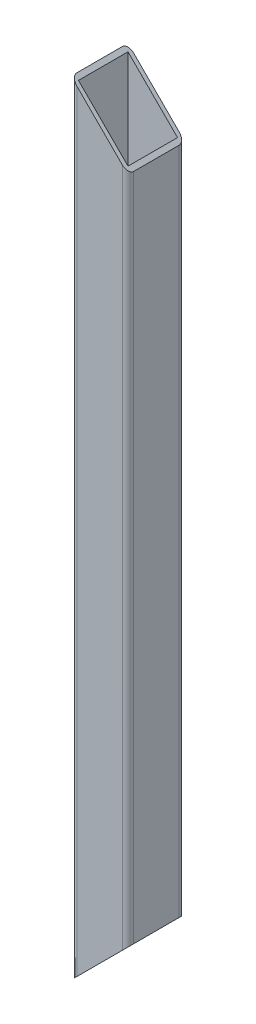
ISO-10303-21;
HEADER;
FILE_DESCRIPTION(('STEP AP214'),'2;1');
FILE_NAME('part.step','',(''),(''),'','','');
FILE_SCHEMA(('AUTOMOTIVE_DESIGN { 1 0 10303 214 1 1 1 1 }'));
ENDSEC;
DATA;
#1=APPLICATION_CONTEXT('core data for automotive mechanical design processes');
#2=APPLICATION_PROTOCOL_DEFINITION('international standard','automotive_design',2000,#1);
#3=PRODUCT_CONTEXT('',#1,'mechanical');
#4=PRODUCT('Part','Part','',(#3));
#5=PRODUCT_RELATED_PRODUCT_CATEGORY('part','',(#4));
#6=PRODUCT_DEFINITION_FORMATION('','',#4);
#7=PRODUCT_DEFINITION_CONTEXT('part definition',#1,'design');
#8=PRODUCT_DEFINITION('design','',#6,#7);
#9=PRODUCT_DEFINITION_SHAPE('','',#8);
#10=(LENGTH_UNIT() NAMED_UNIT(*) SI_UNIT(.MILLI.,.METRE.));
#11=(NAMED_UNIT(*) PLANE_ANGLE_UNIT() SI_UNIT($,.RADIAN.));
#12=(NAMED_UNIT(*) SI_UNIT($,.STERADIAN.) SOLID_ANGLE_UNIT());
#13=UNCERTAINTY_MEASURE_WITH_UNIT(LENGTH_MEASURE(1.E-05),#10,'distance_accuracy_value','');
#14=(GEOMETRIC_REPRESENTATION_CONTEXT(3) GLOBAL_UNCERTAINTY_ASSIGNED_CONTEXT((#13)) GLOBAL_UNIT_ASSIGNED_CONTEXT((#10,
#11,#12)) REPRESENTATION_CONTEXT('',''));
#15=CARTESIAN_POINT('',(0.,0.,0.));
#16=DIRECTION('',(0.,0.,1.));
#17=DIRECTION('',(1.,0.,0.));
#18=AXIS2_PLACEMENT_3D('',#15,#16,#17);
#19=CARTESIAN_POINT('',(-158.75,468.376,1427.861));
#20=DIRECTION('',(-1.,0.,0.));
#21=DIRECTION('',(0.,0.,1.));
#22=AXIS2_PLACEMENT_3D('',#19,#20,#21);
#23=PLANE('',#22);
#24=DIRECTION('',(0.,0.,1.));
#25=VECTOR('',#24,1.);
#26=CARTESIAN_POINT('',(-158.75,157.226,1427.861));
#27=LINE('',#26,#25);
#28=CARTESIAN_POINT('',(-158.75,157.226,1430.401));
#29=VERTEX_POINT('',#28);
#30=CARTESIAN_POINT('',(-158.75,157.226,1450.721));
#31=VERTEX_POINT('',#30);
#32=EDGE_CURVE('E259',#29,#31,#27,.T.);
#33=ORIENTED_EDGE('',*,*,#32,.F.);
#34=DIRECTION('',(0.,-1.,0.));
#35=VECTOR('',#34,1.);
#36=CARTESIAN_POINT('',(-158.75,468.376,1430.401));
#37=LINE('',#36,#35);
#38=CARTESIAN_POINT('',(-158.75,455.676,1430.401));
#39=VERTEX_POINT('',#38);
#40=EDGE_CURVE('E221',#29,#39,#37,.F.);
#41=ORIENTED_EDGE('',*,*,#40,.T.);
#42=DIRECTION('',(0.,0.,-1.));
#43=VECTOR('',#42,1.);
#44=CARTESIAN_POINT('',(-158.75,455.676,1427.861));
#45=LINE('',#44,#43);
#46=CARTESIAN_POINT('',(-158.75,455.676,1450.721));
#47=VERTEX_POINT('',#46);
#48=EDGE_CURVE('E177',#47,#39,#45,.T.);
#49=ORIENTED_EDGE('',*,*,#48,.F.);
#50=DIRECTION('',(0.,-1.,0.));
#51=VECTOR('',#50,1.);
#52=CARTESIAN_POINT('',(-158.75,468.376,1450.721));
#53=LINE('',#52,#51);
#54=EDGE_CURVE('E217',#47,#31,#53,.T.);
#55=ORIENTED_EDGE('',*,*,#54,.T.);
#56=EDGE_LOOP('',(#33,#41,#49,#55));
#57=FACE_BOUND('',#56,.T.);
#58=ADVANCED_FACE('F43',(#57),#23,.F.);
#59=CARTESIAN_POINT('',(-184.15,468.376,1427.861));
#60=DIRECTION('',(0.,0.,1.));
#61=DIRECTION('',(1.,0.,0.));
#62=AXIS2_PLACEMENT_3D('',#59,#60,#61);
#63=PLANE('',#62);
#64=DIRECTION('',(-0.707106781186548,0.707106781186548,0.));
#65=VECTOR('',#64,1.);
#66=CARTESIAN_POINT('',(-177.8,474.726,1427.861));
#67=LINE('',#66,#65);
#68=CARTESIAN_POINT('',(-161.29,458.216,1427.861));
#69=VERTEX_POINT('',#68);
#70=CARTESIAN_POINT('',(-181.61,478.536,1427.861));
#71=VERTEX_POINT('',#70);
#72=EDGE_CURVE('E174',#69,#71,#67,.T.);
#73=ORIENTED_EDGE('',*,*,#72,.F.);
#74=DIRECTION('',(0.,-1.,0.));
#75=VECTOR('',#74,1.);
#76=CARTESIAN_POINT('',(-161.29,468.376,1427.861));
#77=LINE('',#76,#75);
#78=CARTESIAN_POINT('',(-161.29,154.686,1427.861));
#79=VERTEX_POINT('',#78);
#80=EDGE_CURVE('E201',#69,#79,#77,.T.);
#81=ORIENTED_EDGE('',*,*,#80,.T.);
#82=DIRECTION('',(0.707106781186548,0.707106781186548,0.));
#83=VECTOR('',#82,1.);
#84=CARTESIAN_POINT('',(-15.875,300.101,1427.861));
#85=LINE('',#84,#83);
#86=CARTESIAN_POINT('',(-181.61,134.366,1427.861));
#87=VERTEX_POINT('',#86);
#88=EDGE_CURVE('E264',#87,#79,#85,.T.);
#89=ORIENTED_EDGE('',*,*,#88,.F.);
#90=DIRECTION('',(0.,-1.,0.));
#91=VECTOR('',#90,1.);
#92=CARTESIAN_POINT('',(-181.61,468.376,1427.861));
#93=LINE('',#92,#91);
#94=EDGE_CURVE('E173',#87,#71,#93,.F.);
#95=ORIENTED_EDGE('',*,*,#94,.T.);
#96=EDGE_LOOP('',(#73,#81,#89,#95));
#97=FACE_BOUND('',#96,.T.);
#98=ADVANCED_FACE('F298',(#97),#63,.F.);
#99=CARTESIAN_POINT('',(-184.15,468.376,1427.861));
#100=DIRECTION('',(1.,0.,0.));
#101=DIRECTION('',(0.,0.,-1.));
#102=AXIS2_PLACEMENT_3D('',#99,#100,#101);
#103=PLANE('',#102);
#104=DIRECTION('',(0.,0.,1.));
#105=VECTOR('',#104,1.);
#106=CARTESIAN_POINT('',(-184.15,481.076,1427.861));
#107=LINE('',#106,#105);
#108=CARTESIAN_POINT('',(-184.15,481.076,1430.401));
#109=VERTEX_POINT('',#108);
#110=CARTESIAN_POINT('',(-184.15,481.076,1450.721));
#111=VERTEX_POINT('',#110);
#112=EDGE_CURVE('E170',#109,#111,#107,.T.);
#113=ORIENTED_EDGE('',*,*,#112,.F.);
#114=DIRECTION('',(0.,-1.,0.));
#115=VECTOR('',#114,1.);
#116=CARTESIAN_POINT('',(-184.15,468.376,1430.401));
#117=LINE('',#116,#115);
#118=CARTESIAN_POINT('',(-184.15,131.826,1430.401));
#119=VERTEX_POINT('',#118);
#120=EDGE_CURVE('E237',#109,#119,#117,.T.);
#121=ORIENTED_EDGE('',*,*,#120,.T.);
#122=DIRECTION('',(0.,0.,-1.));
#123=VECTOR('',#122,1.);
#124=CARTESIAN_POINT('',(-184.15,131.826,1427.861));
#125=LINE('',#124,#123);
#126=CARTESIAN_POINT('',(-184.15,131.826,1450.721));
#127=VERTEX_POINT('',#126);
#128=EDGE_CURVE('E191',#127,#119,#125,.T.);
#129=ORIENTED_EDGE('',*,*,#128,.F.);
#130=DIRECTION('',(0.,-1.,0.));
#131=VECTOR('',#130,1.);
#132=CARTESIAN_POINT('',(-184.15,468.376,1450.721));
#133=LINE('',#132,#131);
#134=EDGE_CURVE('E59',#127,#111,#133,.F.);
#135=ORIENTED_EDGE('',*,*,#134,.T.);
#136=EDGE_LOOP('',(#113,#121,#129,#135));
#137=FACE_BOUND('',#136,.T.);
#138=ADVANCED_FACE('F290',(#137),#103,.F.);
#139=CARTESIAN_POINT('',(-160.401,468.376,1429.512));
#140=DIRECTION('',(-1.,0.,0.));
#141=DIRECTION('',(0.,0.,1.));
#142=AXIS2_PLACEMENT_3D('',#139,#140,#141);
#143=PLANE('',#142);
#144=DIRECTION('',(0.,-1.,0.));
#145=VECTOR('',#144,1.);
#146=CARTESIAN_POINT('',(-160.401,468.376,1451.61));
#147=LINE('',#146,#145);
#148=CARTESIAN_POINT('',(-160.401,457.327,1451.61));
#149=VERTEX_POINT('',#148);
#150=CARTESIAN_POINT('',(-160.401,155.575,1451.61));
#151=VERTEX_POINT('',#150);
#152=EDGE_CURVE('E186',#149,#151,#147,.T.);
#153=ORIENTED_EDGE('',*,*,#152,.F.);
#154=DIRECTION('',(0.,0.,-1.));
#155=VECTOR('',#154,1.);
#156=CARTESIAN_POINT('',(-160.401,457.327,1429.512));
#157=LINE('',#156,#155);
#158=CARTESIAN_POINT('',(-160.401,457.327,1429.512));
#159=VERTEX_POINT('',#158);
#160=EDGE_CURVE('E182',#149,#159,#157,.T.);
#161=ORIENTED_EDGE('',*,*,#160,.T.);
#162=DIRECTION('',(0.,-1.,0.));
#163=VECTOR('',#162,1.);
#164=CARTESIAN_POINT('',(-160.401,468.376,1429.512));
#165=LINE('',#164,#163);
#166=CARTESIAN_POINT('',(-160.401,155.575,1429.512));
#167=VERTEX_POINT('',#166);
#168=EDGE_CURVE('E161',#159,#167,#165,.T.);
#169=ORIENTED_EDGE('',*,*,#168,.T.);
#170=DIRECTION('',(0.,0.,1.));
#171=VECTOR('',#170,1.);
#172=CARTESIAN_POINT('',(-160.401,155.575,1429.512));
#173=LINE('',#172,#171);
#174=EDGE_CURVE('E187',#167,#151,#173,.T.);
#175=ORIENTED_EDGE('',*,*,#174,.T.);
#176=EDGE_LOOP('',(#153,#161,#169,#175));
#177=FACE_BOUND('',#176,.T.);
#178=ADVANCED_FACE('F288',(#177),#143,.T.);
#179=CARTESIAN_POINT('',(-182.499,468.376,1451.61));
#180=DIRECTION('',(0.,0.,-1.));
#181=DIRECTION('',(-1.,0.,0.));
#182=AXIS2_PLACEMENT_3D('',#179,#180,#181);
#183=PLANE('',#182);
#184=DIRECTION('',(0.,-1.,0.));
#185=VECTOR('',#184,1.);
#186=CARTESIAN_POINT('',(-182.499,468.376,1451.61));
#187=LINE('',#186,#185);
#188=CARTESIAN_POINT('',(-182.499,479.425,1451.61));
#189=VERTEX_POINT('',#188);
#190=CARTESIAN_POINT('',(-182.499,133.477,1451.61));
#191=VERTEX_POINT('',#190);
#192=EDGE_CURVE('E145',#189,#191,#187,.T.);
#193=ORIENTED_EDGE('',*,*,#192,.F.);
#194=DIRECTION('',(0.707106781186548,-0.707106781186548,0.));
#195=VECTOR('',#194,1.);
#196=CARTESIAN_POINT('',(-176.9745,473.9005,1451.61));
#197=LINE('',#196,#195);
#198=EDGE_CURVE('E141',#189,#149,#197,.T.);
#199=ORIENTED_EDGE('',*,*,#198,.T.);
#200=ORIENTED_EDGE('',*,*,#152,.T.);
#201=DIRECTION('',(-0.707106781186548,-0.707106781186548,0.));
#202=VECTOR('',#201,1.);
#203=CARTESIAN_POINT('',(-15.0495,300.9265,1451.61));
#204=LINE('',#203,#202);
#205=EDGE_CURVE('E146',#151,#191,#204,.T.);
#206=ORIENTED_EDGE('',*,*,#205,.T.);
#207=EDGE_LOOP('',(#193,#199,#200,#206));
#208=FACE_BOUND('',#207,.T.);
#209=ADVANCED_FACE('F283',(#208),#183,.T.);
#210=CARTESIAN_POINT('',(-182.499,468.376,1429.512));
#211=DIRECTION('',(1.,0.,0.));
#212=DIRECTION('',(0.,0.,-1.));
#213=AXIS2_PLACEMENT_3D('',#210,#211,#212);
#214=PLANE('',#213);
#215=DIRECTION('',(0.,-1.,0.));
#216=VECTOR('',#215,1.);
#217=CARTESIAN_POINT('',(-182.499,468.376,1429.512));
#218=LINE('',#217,#216);
#219=CARTESIAN_POINT('',(-182.499,479.425,1429.512));
#220=VERTEX_POINT('',#219);
#221=CARTESIAN_POINT('',(-182.499,133.477,1429.512));
#222=VERTEX_POINT('',#221);
#223=EDGE_CURVE('E149',#220,#222,#218,.T.);
#224=ORIENTED_EDGE('',*,*,#223,.F.);
#225=DIRECTION('',(0.,0.,1.));
#226=VECTOR('',#225,1.);
#227=CARTESIAN_POINT('',(-182.499,479.425,1429.512));
#228=LINE('',#227,#226);
#229=EDGE_CURVE('E134',#220,#189,#228,.T.);
#230=ORIENTED_EDGE('',*,*,#229,.T.);
#231=ORIENTED_EDGE('',*,*,#192,.T.);
#232=DIRECTION('',(0.,0.,-1.));
#233=VECTOR('',#232,1.);
#234=CARTESIAN_POINT('',(-182.499,133.477,1429.512));
#235=LINE('',#234,#233);
#236=EDGE_CURVE('E152',#191,#222,#235,.T.);
#237=ORIENTED_EDGE('',*,*,#236,.T.);
#238=EDGE_LOOP('',(#224,#230,#231,#237));
#239=FACE_BOUND('',#238,.T.);
#240=ADVANCED_FACE('F150',(#239),#214,.T.);
#241=CARTESIAN_POINT('',(-182.499,468.376,1429.512));
#242=DIRECTION('',(0.,0.,1.));
#243=DIRECTION('',(1.,0.,0.));
#244=AXIS2_PLACEMENT_3D('',#241,#242,#243);
#245=PLANE('',#244);
#246=ORIENTED_EDGE('',*,*,#168,.F.);
#247=DIRECTION('',(-0.707106781186548,0.707106781186548,0.));
#248=VECTOR('',#247,1.);
#249=CARTESIAN_POINT('',(-176.9745,473.9005,1429.512));
#250=LINE('',#249,#248);
#251=EDGE_CURVE('E138',#159,#220,#250,.T.);
#252=ORIENTED_EDGE('',*,*,#251,.T.);
#253=ORIENTED_EDGE('',*,*,#223,.T.);
#254=DIRECTION('',(0.707106781186548,0.707106781186548,0.));
#255=VECTOR('',#254,1.);
#256=CARTESIAN_POINT('',(-15.0495,300.9265,1429.512));
#257=LINE('',#256,#255);
#258=EDGE_CURVE('E157',#222,#167,#257,.T.);
#259=ORIENTED_EDGE('',*,*,#258,.T.);
#260=EDGE_LOOP('',(#246,#252,#253,#259));
#261=FACE_BOUND('',#260,.T.);
#262=ADVANCED_FACE('F160',(#261),#245,.T.);
#263=CARTESIAN_POINT('',(-184.15,468.376,1453.261));
#264=DIRECTION('',(0.,0.,-1.));
#265=DIRECTION('',(-1.,0.,0.));
#266=AXIS2_PLACEMENT_3D('',#263,#264,#265);
#267=PLANE('',#266);
#268=DIRECTION('',(0.707106781186548,-0.707106781186548,0.));
#269=VECTOR('',#268,1.);
#270=CARTESIAN_POINT('',(-177.8,474.726,1453.261));
#271=LINE('',#270,#269);
#272=CARTESIAN_POINT('',(-181.61,478.536,1453.261));
#273=VERTEX_POINT('',#272);
#274=CARTESIAN_POINT('',(-161.29,458.216,1453.261));
#275=VERTEX_POINT('',#274);
#276=EDGE_CURVE('E181',#273,#275,#271,.T.);
#277=ORIENTED_EDGE('',*,*,#276,.F.);
#278=DIRECTION('',(0.,-1.,0.));
#279=VECTOR('',#278,1.);
#280=CARTESIAN_POINT('',(-181.61,468.376,1453.261));
#281=LINE('',#280,#279);
#282=CARTESIAN_POINT('',(-181.61,134.366,1453.261));
#283=VERTEX_POINT('',#282);
#284=EDGE_CURVE('E11',#273,#283,#281,.T.);
#285=ORIENTED_EDGE('',*,*,#284,.T.);
#286=DIRECTION('',(-0.707106781186548,-0.707106781186548,0.));
#287=VECTOR('',#286,1.);
#288=CARTESIAN_POINT('',(-15.875,300.101,1453.261));
#289=LINE('',#288,#287);
#290=CARTESIAN_POINT('',(-161.29,154.686,1453.261));
#291=VERTEX_POINT('',#290);
#292=EDGE_CURVE('E250',#291,#283,#289,.T.);
#293=ORIENTED_EDGE('',*,*,#292,.F.);
#294=DIRECTION('',(0.,-1.,0.));
#295=VECTOR('',#294,1.);
#296=CARTESIAN_POINT('',(-161.29,468.376,1453.261));
#297=LINE('',#296,#295);
#298=EDGE_CURVE('E52',#291,#275,#297,.F.);
#299=ORIENTED_EDGE('',*,*,#298,.T.);
#300=EDGE_LOOP('',(#277,#285,#293,#299));
#301=FACE_BOUND('',#300,.T.);
#302=ADVANCED_FACE('F247',(#301),#267,.F.);
#303=CARTESIAN_POINT('',(-171.45,144.526,1440.561));
#304=DIRECTION('',(0.707106781186548,-0.707106781186547,0.));
#305=DIRECTION('',(0.707106781186548,0.707106781186548,0.));
#306=AXIS2_PLACEMENT_3D('',#303,#304,#305);
#307=PLANE('',#306);
#308=ORIENTED_EDGE('',*,*,#174,.F.);
#309=ORIENTED_EDGE('',*,*,#258,.F.);
#310=ORIENTED_EDGE('',*,*,#236,.F.);
#311=ORIENTED_EDGE('',*,*,#205,.F.);
#312=EDGE_LOOP('',(#308,#309,#310,#311));
#313=FACE_BOUND('',#312,.T.);
#314=ORIENTED_EDGE('',*,*,#88,.T.);
#315=CARTESIAN_POINT('',(-161.29,154.686,1430.401));
#316=DIRECTION('',(0.707106781186548,-0.707106781186547,0.));
#317=DIRECTION('',(-0.707106781186548,-0.707106781186548,0.));
#318=AXIS2_PLACEMENT_3D('',#315,#316,#317);
#319=ELLIPSE('',#318,3.59210244842766,2.54);
#320=EDGE_CURVE('E214',#79,#29,#319,.T.);
#321=ORIENTED_EDGE('',*,*,#320,.T.);
#322=ORIENTED_EDGE('',*,*,#32,.T.);
#323=CARTESIAN_POINT('',(-161.29,154.686,1450.721));
#324=DIRECTION('',(0.707106781186548,-0.707106781186547,0.));
#325=DIRECTION('',(-0.707106781186548,-0.707106781186548,0.));
#326=AXIS2_PLACEMENT_3D('',#323,#324,#325);
#327=ELLIPSE('',#326,3.59210244842766,2.54);
#328=EDGE_CURVE('E205',#31,#291,#327,.T.);
#329=ORIENTED_EDGE('',*,*,#328,.T.);
#330=ORIENTED_EDGE('',*,*,#292,.T.);
#331=CARTESIAN_POINT('',(-181.61,134.366,1450.721));
#332=DIRECTION('',(0.707106781186548,-0.707106781186547,0.));
#333=DIRECTION('',(-0.707106781186548,-0.707106781186548,0.));
#334=AXIS2_PLACEMENT_3D('',#331,#332,#333);
#335=ELLIPSE('',#334,3.59210244842766,2.54);
#336=EDGE_CURVE('E208',#283,#127,#335,.T.);
#337=ORIENTED_EDGE('',*,*,#336,.T.);
#338=ORIENTED_EDGE('',*,*,#128,.T.);
#339=CARTESIAN_POINT('',(-181.61,134.366,1430.401));
#340=DIRECTION('',(0.707106781186548,-0.707106781186547,0.));
#341=DIRECTION('',(-0.707106781186548,-0.707106781186548,0.));
#342=AXIS2_PLACEMENT_3D('',#339,#340,#341);
#343=ELLIPSE('',#342,3.59210244842766,2.54);
#344=EDGE_CURVE('E211',#119,#87,#343,.T.);
#345=ORIENTED_EDGE('',*,*,#344,.T.);
#346=EDGE_LOOP('',(#314,#321,#322,#329,#330,#337,#338,#345));
#347=FACE_BOUND('',#346,.T.);
#348=ADVANCED_FACE('F263',(#313,#347),#307,.T.);
#349=CARTESIAN_POINT('',(-171.45,468.376,1440.561));
#350=DIRECTION('',(0.707106781186548,0.707106781186548,0.));
#351=DIRECTION('',(-0.707106781186548,0.707106781186548,0.));
#352=AXIS2_PLACEMENT_3D('',#349,#350,#351);
#353=PLANE('',#352);
#354=ORIENTED_EDGE('',*,*,#160,.F.);
#355=ORIENTED_EDGE('',*,*,#198,.F.);
#356=ORIENTED_EDGE('',*,*,#229,.F.);
#357=ORIENTED_EDGE('',*,*,#251,.F.);
#358=EDGE_LOOP('',(#354,#355,#356,#357));
#359=FACE_BOUND('',#358,.T.);
#360=ORIENTED_EDGE('',*,*,#48,.T.);
#361=CARTESIAN_POINT('',(-161.29,458.216,1430.401));
#362=DIRECTION('',(0.707106781186548,0.707106781186548,0.));
#363=DIRECTION('',(0.707106781186548,-0.707106781186548,0.));
#364=AXIS2_PLACEMENT_3D('',#361,#362,#363);
#365=ELLIPSE('',#364,3.59210244842766,2.54);
#366=EDGE_CURVE('E232',#39,#69,#365,.T.);
#367=ORIENTED_EDGE('',*,*,#366,.T.);
#368=ORIENTED_EDGE('',*,*,#72,.T.);
#369=CARTESIAN_POINT('',(-181.61,478.536,1430.401));
#370=DIRECTION('',(0.707106781186548,0.707106781186548,0.));
#371=DIRECTION('',(0.707106781186548,-0.707106781186548,0.));
#372=AXIS2_PLACEMENT_3D('',#369,#370,#371);
#373=ELLIPSE('',#372,3.59210244842766,2.54);
#374=EDGE_CURVE('E66',#71,#109,#373,.T.);
#375=ORIENTED_EDGE('',*,*,#374,.T.);
#376=ORIENTED_EDGE('',*,*,#112,.T.);
#377=CARTESIAN_POINT('',(-181.61,478.536,1450.721));
#378=DIRECTION('',(0.707106781186548,0.707106781186548,0.));
#379=DIRECTION('',(0.707106781186548,-0.707106781186548,0.));
#380=AXIS2_PLACEMENT_3D('',#377,#378,#379);
#381=ELLIPSE('',#380,3.59210244842766,2.54);
#382=EDGE_CURVE('E227',#111,#273,#381,.T.);
#383=ORIENTED_EDGE('',*,*,#382,.T.);
#384=ORIENTED_EDGE('',*,*,#276,.T.);
#385=CARTESIAN_POINT('',(-161.29,458.216,1450.721));
#386=DIRECTION('',(0.707106781186548,0.707106781186548,0.));
#387=DIRECTION('',(0.707106781186548,-0.707106781186548,0.));
#388=AXIS2_PLACEMENT_3D('',#385,#386,#387);
#389=ELLIPSE('',#388,3.59210244842766,2.54);
#390=EDGE_CURVE('E224',#275,#47,#389,.T.);
#391=ORIENTED_EDGE('',*,*,#390,.T.);
#392=EDGE_LOOP('',(#360,#367,#368,#375,#376,#383,#384,#391));
#393=FACE_BOUND('',#392,.T.);
#394=ADVANCED_FACE('F136',(#359,#393),#353,.T.);
#395=CARTESIAN_POINT('',(-161.29,468.376,1430.401));
#396=DIRECTION('',(0.,-1.,0.));
#397=DIRECTION('',(0.,0.,-1.));
#398=AXIS2_PLACEMENT_3D('',#395,#396,#397);
#399=CYLINDRICAL_SURFACE('',#398,2.54);
#400=ORIENTED_EDGE('',*,*,#366,.F.);
#401=ORIENTED_EDGE('',*,*,#40,.F.);
#402=ORIENTED_EDGE('',*,*,#320,.F.);
#403=ORIENTED_EDGE('',*,*,#80,.F.);
#404=EDGE_LOOP('',(#400,#401,#402,#403));
#405=FACE_BOUND('',#404,.T.);
#406=ADVANCED_FACE('F312',(#405),#399,.T.);
#407=CARTESIAN_POINT('',(-181.61,468.376,1430.401));
#408=DIRECTION('',(0.,-1.,0.));
#409=DIRECTION('',(0.,0.,-1.));
#410=AXIS2_PLACEMENT_3D('',#407,#408,#409);
#411=CYLINDRICAL_SURFACE('',#410,2.54);
#412=ORIENTED_EDGE('',*,*,#374,.F.);
#413=ORIENTED_EDGE('',*,*,#94,.F.);
#414=ORIENTED_EDGE('',*,*,#344,.F.);
#415=ORIENTED_EDGE('',*,*,#120,.F.);
#416=EDGE_LOOP('',(#412,#413,#414,#415));
#417=FACE_BOUND('',#416,.T.);
#418=ADVANCED_FACE('F315',(#417),#411,.T.);
#419=CARTESIAN_POINT('',(-181.61,468.376,1450.721));
#420=DIRECTION('',(0.,-1.,0.));
#421=DIRECTION('',(0.,0.,-1.));
#422=AXIS2_PLACEMENT_3D('',#419,#420,#421);
#423=CYLINDRICAL_SURFACE('',#422,2.54);
#424=ORIENTED_EDGE('',*,*,#382,.F.);
#425=ORIENTED_EDGE('',*,*,#134,.F.);
#426=ORIENTED_EDGE('',*,*,#336,.F.);
#427=ORIENTED_EDGE('',*,*,#284,.F.);
#428=EDGE_LOOP('',(#424,#425,#426,#427));
#429=FACE_BOUND('',#428,.T.);
#430=ADVANCED_FACE('F318',(#429),#423,.T.);
#431=CARTESIAN_POINT('',(-161.29,468.376,1450.721));
#432=DIRECTION('',(0.,-1.,0.));
#433=DIRECTION('',(0.,0.,-1.));
#434=AXIS2_PLACEMENT_3D('',#431,#432,#433);
#435=CYLINDRICAL_SURFACE('',#434,2.54);
#436=ORIENTED_EDGE('',*,*,#390,.F.);
#437=ORIENTED_EDGE('',*,*,#298,.F.);
#438=ORIENTED_EDGE('',*,*,#328,.F.);
#439=ORIENTED_EDGE('',*,*,#54,.F.);
#440=EDGE_LOOP('',(#436,#437,#438,#439));
#441=FACE_BOUND('',#440,.T.);
#442=ADVANCED_FACE('F45',(#441),#435,.T.);
#443=CLOSED_SHELL('',(#58,#98,#138,#178,#209,#240,#262,#302,#348,#394,#406,#418,#430,#442));
#444=MANIFOLD_SOLID_BREP('B2',#443);
#445=ADVANCED_BREP_SHAPE_REPRESENTATION('',(#18,#444),#14);
#446=SHAPE_DEFINITION_REPRESENTATION(#9,#445);
ENDSEC;
END-ISO-10303-21;
